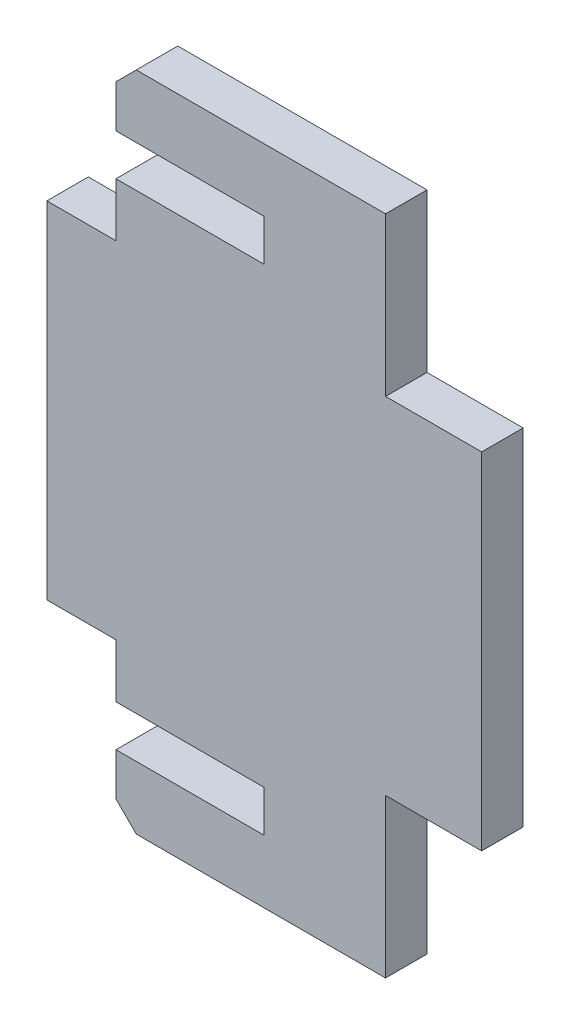
ISO-10303-21;
HEADER;
FILE_DESCRIPTION(('STEP AP214'),'2;1');
FILE_NAME('part.step','',(''),(''),'','','');
FILE_SCHEMA(('AUTOMOTIVE_DESIGN { 1 0 10303 214 1 1 1 1 }'));
ENDSEC;
DATA;
#1=APPLICATION_CONTEXT('core data for automotive mechanical design processes');
#2=APPLICATION_PROTOCOL_DEFINITION('international standard','automotive_design',2000,#1);
#3=PRODUCT_CONTEXT('',#1,'mechanical');
#4=PRODUCT('Part','Part','',(#3));
#5=PRODUCT_RELATED_PRODUCT_CATEGORY('part','',(#4));
#6=PRODUCT_DEFINITION_FORMATION('','',#4);
#7=PRODUCT_DEFINITION_CONTEXT('part definition',#1,'design');
#8=PRODUCT_DEFINITION('design','',#6,#7);
#9=PRODUCT_DEFINITION_SHAPE('','',#8);
#10=(LENGTH_UNIT() NAMED_UNIT(*) SI_UNIT(.MILLI.,.METRE.));
#11=(NAMED_UNIT(*) PLANE_ANGLE_UNIT() SI_UNIT($,.RADIAN.));
#12=(NAMED_UNIT(*) SI_UNIT($,.STERADIAN.) SOLID_ANGLE_UNIT());
#13=UNCERTAINTY_MEASURE_WITH_UNIT(LENGTH_MEASURE(1.E-05),#10,'distance_accuracy_value','');
#14=(GEOMETRIC_REPRESENTATION_CONTEXT(3) GLOBAL_UNCERTAINTY_ASSIGNED_CONTEXT((#13)) GLOBAL_UNIT_ASSIGNED_CONTEXT((#10,
#11,#12)) REPRESENTATION_CONTEXT('',''));
#15=CARTESIAN_POINT('',(0.,0.,0.));
#16=DIRECTION('',(0.,0.,1.));
#17=DIRECTION('',(1.,0.,0.));
#18=AXIS2_PLACEMENT_3D('',#15,#16,#17);
#19=CARTESIAN_POINT('',(610.776131740149,-34.8210432887047,-2.99999999999988));
#20=DIRECTION('',(0.,-1.,0.));
#21=DIRECTION('',(1.,0.,0.));
#22=AXIS2_PLACEMENT_3D('',#19,#20,#21);
#23=PLANE('',#22);
#24=DIRECTION('',(1.,0.,0.));
#25=VECTOR('',#24,1.);
#26=CARTESIAN_POINT('',(610.776131740149,-34.8210432887046,1.00613961606655E-13));
#27=LINE('',#26,#25);
#28=CARTESIAN_POINT('',(610.776131740149,-34.8210432887046,1.00613961606655E-13));
#29=VERTEX_POINT('',#28);
#30=CARTESIAN_POINT('',(628.807360223135,-34.8210432887047,0.));
#31=VERTEX_POINT('',#30);
#32=EDGE_CURVE('E180',#29,#31,#27,.T.);
#33=ORIENTED_EDGE('',*,*,#32,.F.);
#34=DIRECTION('',(0.,0.,1.));
#35=VECTOR('',#34,1.);
#36=CARTESIAN_POINT('',(610.776131740149,-34.8210432887047,-2.99999999999988));
#37=LINE('',#36,#35);
#38=CARTESIAN_POINT('',(610.776131740149,-34.8210432887047,-2.99999999999988));
#39=VERTEX_POINT('',#38);
#40=EDGE_CURVE('E11',#39,#29,#37,.T.);
#41=ORIENTED_EDGE('',*,*,#40,.F.);
#42=DIRECTION('',(1.,0.,0.));
#43=VECTOR('',#42,1.);
#44=CARTESIAN_POINT('',(610.776131740149,-34.8210432887047,-2.99999999999988));
#45=LINE('',#44,#43);
#46=CARTESIAN_POINT('',(628.807360223135,-34.8210432887046,-2.99999999999993));
#47=VERTEX_POINT('',#46);
#48=EDGE_CURVE('E182',#39,#47,#45,.T.);
#49=ORIENTED_EDGE('',*,*,#48,.T.);
#50=DIRECTION('',(0.,0.,1.));
#51=VECTOR('',#50,1.);
#52=CARTESIAN_POINT('',(628.807360223135,-34.8210432887046,-2.99999999999993));
#53=LINE('',#52,#51);
#54=EDGE_CURVE('E35',#47,#31,#53,.T.);
#55=ORIENTED_EDGE('',*,*,#54,.T.);
#56=EDGE_LOOP('',(#33,#41,#49,#55));
#57=FACE_BOUND('',#56,.T.);
#58=ADVANCED_FACE('F32',(#57),#23,.T.);
#59=CARTESIAN_POINT('',(610.776131740149,-34.8210432887047,-2.99999999999988));
#60=DIRECTION('',(-0.707106781186527,-0.707106781186567,0.));
#61=DIRECTION('',(0.707106781186568,-0.707106781186528,0.));
#62=AXIS2_PLACEMENT_3D('',#59,#60,#61);
#63=PLANE('',#62);
#64=DIRECTION('',(0.707106781186568,-0.707106781186528,0.));
#65=VECTOR('',#64,1.);
#66=CARTESIAN_POINT('',(610.776131740149,-34.8210432887046,1.00613961606655E-13));
#67=LINE('',#66,#65);
#68=CARTESIAN_POINT('',(609.307360223135,-33.3522717716907,0.));
#69=VERTEX_POINT('',#68);
#70=EDGE_CURVE('E198',#69,#29,#67,.T.);
#71=ORIENTED_EDGE('',*,*,#70,.F.);
#72=DIRECTION('',(0.,0.,1.));
#73=VECTOR('',#72,1.);
#74=CARTESIAN_POINT('',(609.307360223135,-33.3522717716906,-2.99999999999996));
#75=LINE('',#74,#73);
#76=CARTESIAN_POINT('',(609.307360223135,-33.3522717716906,-2.99999999999996));
#77=VERTEX_POINT('',#76);
#78=EDGE_CURVE('E40',#77,#69,#75,.T.);
#79=ORIENTED_EDGE('',*,*,#78,.F.);
#80=DIRECTION('',(0.707106781186568,-0.707106781186528,0.));
#81=VECTOR('',#80,1.);
#82=CARTESIAN_POINT('',(610.776131740149,-34.8210432887047,-2.99999999999988));
#83=LINE('',#82,#81);
#84=EDGE_CURVE('E187',#77,#39,#83,.T.);
#85=ORIENTED_EDGE('',*,*,#84,.T.);
#86=ORIENTED_EDGE('',*,*,#40,.T.);
#87=EDGE_LOOP('',(#71,#79,#85,#86));
#88=FACE_BOUND('',#87,.T.);
#89=ADVANCED_FACE('F430',(#88),#63,.T.);
#90=CARTESIAN_POINT('',(609.307360223135,-30.2698798894849,-2.99999999999993));
#91=DIRECTION('',(-1.,0.,0.));
#92=DIRECTION('',(0.,0.,1.));
#93=AXIS2_PLACEMENT_3D('',#90,#91,#92);
#94=PLANE('',#93);
#95=DIRECTION('',(0.,-1.,0.));
#96=VECTOR('',#95,1.);
#97=CARTESIAN_POINT('',(609.307360223135,-30.2698798894849,0.));
#98=LINE('',#97,#96);
#99=CARTESIAN_POINT('',(609.307360223135,-30.2698798894849,0.));
#100=VERTEX_POINT('',#99);
#101=EDGE_CURVE('E253',#100,#69,#98,.T.);
#102=ORIENTED_EDGE('',*,*,#101,.F.);
#103=DIRECTION('',(0.,0.,1.));
#104=VECTOR('',#103,1.);
#105=CARTESIAN_POINT('',(609.307360223135,-30.2698798894849,-2.99999999999993));
#106=LINE('',#105,#104);
#107=CARTESIAN_POINT('',(609.307360223135,-30.2698798894849,-2.99999999999993));
#108=VERTEX_POINT('',#107);
#109=EDGE_CURVE('E317',#108,#100,#106,.T.);
#110=ORIENTED_EDGE('',*,*,#109,.F.);
#111=DIRECTION('',(0.,-1.,0.));
#112=VECTOR('',#111,1.);
#113=CARTESIAN_POINT('',(609.307360223135,-30.2698798894849,-2.99999999999993));
#114=LINE('',#113,#112);
#115=EDGE_CURVE('E313',#108,#77,#114,.T.);
#116=ORIENTED_EDGE('',*,*,#115,.T.);
#117=ORIENTED_EDGE('',*,*,#78,.T.);
#118=EDGE_LOOP('',(#102,#110,#116,#117));
#119=FACE_BOUND('',#118,.T.);
#120=ADVANCED_FACE('F426',(#119),#94,.T.);
#121=CARTESIAN_POINT('',(620.002394878024,-30.2698798894849,-2.99999999999991));
#122=DIRECTION('',(0.,1.,0.));
#123=DIRECTION('',(-1.,0.,0.));
#124=AXIS2_PLACEMENT_3D('',#121,#122,#123);
#125=PLANE('',#124);
#126=DIRECTION('',(-1.,0.,0.));
#127=VECTOR('',#126,1.);
#128=CARTESIAN_POINT('',(620.002394878024,-30.2698798894848,0.));
#129=LINE('',#128,#127);
#130=CARTESIAN_POINT('',(620.002394878024,-30.2698798894848,0.));
#131=VERTEX_POINT('',#130);
#132=EDGE_CURVE('E250',#131,#100,#129,.T.);
#133=ORIENTED_EDGE('',*,*,#132,.F.);
#134=DIRECTION('',(0.,0.,1.));
#135=VECTOR('',#134,1.);
#136=CARTESIAN_POINT('',(620.002394878024,-30.2698798894849,-2.99999999999991));
#137=LINE('',#136,#135);
#138=CARTESIAN_POINT('',(620.002394878024,-30.2698798894849,-2.99999999999991));
#139=VERTEX_POINT('',#138);
#140=EDGE_CURVE('E319',#139,#131,#137,.T.);
#141=ORIENTED_EDGE('',*,*,#140,.F.);
#142=DIRECTION('',(-1.,0.,0.));
#143=VECTOR('',#142,1.);
#144=CARTESIAN_POINT('',(620.002394878024,-30.2698798894849,-2.99999999999991));
#145=LINE('',#144,#143);
#146=EDGE_CURVE('E310',#139,#108,#145,.T.);
#147=ORIENTED_EDGE('',*,*,#146,.T.);
#148=ORIENTED_EDGE('',*,*,#109,.T.);
#149=EDGE_LOOP('',(#133,#141,#147,#148));
#150=FACE_BOUND('',#149,.T.);
#151=ADVANCED_FACE('F422',(#150),#125,.T.);
#152=CARTESIAN_POINT('',(620.006556706234,-27.2698827762886,-2.99999999999989));
#153=DIRECTION('',(-0.99999903773209,0.0013872760700569,0.));
#154=DIRECTION('',(-0.00138727607005612,-0.99999903773209,0.));
#155=AXIS2_PLACEMENT_3D('',#152,#153,#154);
#156=PLANE('',#155);
#157=DIRECTION('',(-0.00138727607005612,-0.99999903773209,0.));
#158=VECTOR('',#157,1.);
#159=CARTESIAN_POINT('',(620.006556706234,-27.2698827762885,1.09287578986539E-13));
#160=LINE('',#159,#158);
#161=CARTESIAN_POINT('',(620.006556706234,-27.2698827762885,1.09287578986539E-13));
#162=VERTEX_POINT('',#161);
#163=EDGE_CURVE('E247',#162,#131,#160,.T.);
#164=ORIENTED_EDGE('',*,*,#163,.F.);
#165=DIRECTION('',(0.,0.,1.));
#166=VECTOR('',#165,1.);
#167=CARTESIAN_POINT('',(620.006556706234,-27.2698827762886,-2.99999999999989));
#168=LINE('',#167,#166);
#169=CARTESIAN_POINT('',(620.006556706234,-27.2698827762886,-2.99999999999989));
#170=VERTEX_POINT('',#169);
#171=EDGE_CURVE('E321',#170,#162,#168,.T.);
#172=ORIENTED_EDGE('',*,*,#171,.F.);
#173=DIRECTION('',(-0.00138727607005612,-0.99999903773209,0.));
#174=VECTOR('',#173,1.);
#175=CARTESIAN_POINT('',(620.006556706234,-27.2698827762886,-2.99999999999989));
#176=LINE('',#175,#174);
#177=EDGE_CURVE('E307',#170,#139,#176,.T.);
#178=ORIENTED_EDGE('',*,*,#177,.T.);
#179=ORIENTED_EDGE('',*,*,#140,.T.);
#180=EDGE_LOOP('',(#164,#172,#178,#179));
#181=FACE_BOUND('',#180,.T.);
#182=ADVANCED_FACE('F418',(#181),#156,.T.);
#183=CARTESIAN_POINT('',(609.307360223135,-27.2698827762886,-2.99999999999995));
#184=DIRECTION('',(0.,-1.,0.));
#185=DIRECTION('',(0.,0.,-1.));
#186=AXIS2_PLACEMENT_3D('',#183,#184,#185);
#187=PLANE('',#186);
#188=DIRECTION('',(1.,0.,0.));
#189=VECTOR('',#188,1.);
#190=CARTESIAN_POINT('',(609.307360223135,-27.2698827762886,0.));
#191=LINE('',#190,#189);
#192=CARTESIAN_POINT('',(609.307360223135,-27.2698827762886,0.));
#193=VERTEX_POINT('',#192);
#194=EDGE_CURVE('E244',#193,#162,#191,.T.);
#195=ORIENTED_EDGE('',*,*,#194,.F.);
#196=DIRECTION('',(0.,0.,1.));
#197=VECTOR('',#196,1.);
#198=CARTESIAN_POINT('',(609.307360223135,-27.2698827762886,-2.99999999999995));
#199=LINE('',#198,#197);
#200=CARTESIAN_POINT('',(609.307360223135,-27.2698827762886,-2.99999999999995));
#201=VERTEX_POINT('',#200);
#202=EDGE_CURVE('E323',#201,#193,#199,.T.);
#203=ORIENTED_EDGE('',*,*,#202,.F.);
#204=DIRECTION('',(1.,0.,0.));
#205=VECTOR('',#204,1.);
#206=CARTESIAN_POINT('',(609.307360223135,-27.2698827762886,-2.99999999999995));
#207=LINE('',#206,#205);
#208=EDGE_CURVE('E304',#201,#170,#207,.T.);
#209=ORIENTED_EDGE('',*,*,#208,.T.);
#210=ORIENTED_EDGE('',*,*,#171,.T.);
#211=EDGE_LOOP('',(#195,#203,#209,#210));
#212=FACE_BOUND('',#211,.T.);
#213=ADVANCED_FACE('F414',(#212),#187,.T.);
#214=CARTESIAN_POINT('',(609.307360223135,-23.3847686082293,-2.99999999999995));
#215=DIRECTION('',(-1.,0.,0.));
#216=DIRECTION('',(0.,-1.,0.));
#217=AXIS2_PLACEMENT_3D('',#214,#215,#216);
#218=PLANE('',#217);
#219=DIRECTION('',(0.,-1.,0.));
#220=VECTOR('',#219,1.);
#221=CARTESIAN_POINT('',(609.307360223135,-23.3847686082294,0.));
#222=LINE('',#221,#220);
#223=CARTESIAN_POINT('',(609.307360223135,-23.3847686082294,0.));
#224=VERTEX_POINT('',#223);
#225=EDGE_CURVE('E241',#224,#193,#222,.T.);
#226=ORIENTED_EDGE('',*,*,#225,.F.);
#227=DIRECTION('',(0.,0.,1.));
#228=VECTOR('',#227,1.);
#229=CARTESIAN_POINT('',(609.307360223135,-23.3847686082293,-2.99999999999995));
#230=LINE('',#229,#228);
#231=CARTESIAN_POINT('',(609.307360223135,-23.3847686082293,-2.99999999999995));
#232=VERTEX_POINT('',#231);
#233=EDGE_CURVE('E325',#232,#224,#230,.T.);
#234=ORIENTED_EDGE('',*,*,#233,.F.);
#235=DIRECTION('',(0.,-1.,0.));
#236=VECTOR('',#235,1.);
#237=CARTESIAN_POINT('',(609.307360223135,-23.3847686082293,-2.99999999999995));
#238=LINE('',#237,#236);
#239=EDGE_CURVE('E301',#232,#201,#238,.T.);
#240=ORIENTED_EDGE('',*,*,#239,.T.);
#241=ORIENTED_EDGE('',*,*,#202,.T.);
#242=EDGE_LOOP('',(#226,#234,#240,#241));
#243=FACE_BOUND('',#242,.T.);
#244=ADVANCED_FACE('F410',(#243),#218,.T.);
#245=CARTESIAN_POINT('',(604.307360223135,-23.3847686082293,-2.99999999999995));
#246=DIRECTION('',(0.,-1.,0.));
#247=DIRECTION('',(0.,0.,-1.));
#248=AXIS2_PLACEMENT_3D('',#245,#246,#247);
#249=PLANE('',#248);
#250=DIRECTION('',(1.,0.,0.));
#251=VECTOR('',#250,1.);
#252=CARTESIAN_POINT('',(604.307360223135,-23.3847686082294,1.02348685082632E-13));
#253=LINE('',#252,#251);
#254=CARTESIAN_POINT('',(604.307360223135,-23.3847686082294,1.02348685082632E-13));
#255=VERTEX_POINT('',#254);
#256=EDGE_CURVE('E238',#255,#224,#253,.T.);
#257=ORIENTED_EDGE('',*,*,#256,.F.);
#258=DIRECTION('',(0.,0.,1.));
#259=VECTOR('',#258,1.);
#260=CARTESIAN_POINT('',(604.307360223135,-23.3847686082293,-2.99999999999995));
#261=LINE('',#260,#259);
#262=CARTESIAN_POINT('',(604.307360223135,-23.3847686082293,-2.99999999999995));
#263=VERTEX_POINT('',#262);
#264=EDGE_CURVE('E327',#263,#255,#261,.T.);
#265=ORIENTED_EDGE('',*,*,#264,.F.);
#266=DIRECTION('',(1.,0.,0.));
#267=VECTOR('',#266,1.);
#268=CARTESIAN_POINT('',(604.307360223135,-23.3847686082293,-2.99999999999995));
#269=LINE('',#268,#267);
#270=EDGE_CURVE('E298',#263,#232,#269,.T.);
#271=ORIENTED_EDGE('',*,*,#270,.T.);
#272=ORIENTED_EDGE('',*,*,#233,.T.);
#273=EDGE_LOOP('',(#257,#265,#271,#272));
#274=FACE_BOUND('',#273,.T.);
#275=ADVANCED_FACE('F406',(#274),#249,.T.);
#276=CARTESIAN_POINT('',(604.307360223135,1.61523139177064,-2.99999999999992));
#277=DIRECTION('',(-1.,0.,0.));
#278=DIRECTION('',(0.,0.,1.));
#279=AXIS2_PLACEMENT_3D('',#276,#277,#278);
#280=PLANE('',#279);
#281=DIRECTION('',(0.,-1.,0.));
#282=VECTOR('',#281,1.);
#283=CARTESIAN_POINT('',(604.307360223135,1.61523139177069,0.));
#284=LINE('',#283,#282);
#285=CARTESIAN_POINT('',(604.307360223135,1.61523139177069,0.));
#286=VERTEX_POINT('',#285);
#287=EDGE_CURVE('E235',#286,#255,#284,.T.);
#288=ORIENTED_EDGE('',*,*,#287,.F.);
#289=DIRECTION('',(0.,0.,1.));
#290=VECTOR('',#289,1.);
#291=CARTESIAN_POINT('',(604.307360223135,1.61523139177064,-2.99999999999992));
#292=LINE('',#291,#290);
#293=CARTESIAN_POINT('',(604.307360223135,1.61523139177064,-2.99999999999992));
#294=VERTEX_POINT('',#293);
#295=EDGE_CURVE('E329',#294,#286,#292,.T.);
#296=ORIENTED_EDGE('',*,*,#295,.F.);
#297=DIRECTION('',(0.,-1.,0.));
#298=VECTOR('',#297,1.);
#299=CARTESIAN_POINT('',(604.307360223135,1.61523139177064,-2.99999999999992));
#300=LINE('',#299,#298);
#301=EDGE_CURVE('E295',#294,#263,#300,.T.);
#302=ORIENTED_EDGE('',*,*,#301,.T.);
#303=ORIENTED_EDGE('',*,*,#264,.T.);
#304=EDGE_LOOP('',(#288,#296,#302,#303));
#305=FACE_BOUND('',#304,.T.);
#306=ADVANCED_FACE('F402',(#305),#280,.T.);
#307=CARTESIAN_POINT('',(604.307360223135,1.61523139177064,-2.99999999999992));
#308=DIRECTION('',(0.,1.,0.));
#309=DIRECTION('',(-1.,0.,0.));
#310=AXIS2_PLACEMENT_3D('',#307,#308,#309);
#311=PLANE('',#310);
#312=DIRECTION('',(-1.,0.,0.));
#313=VECTOR('',#312,1.);
#314=CARTESIAN_POINT('',(604.307360223135,1.61523139177069,0.));
#315=LINE('',#314,#313);
#316=CARTESIAN_POINT('',(609.307360223135,1.61523139177061,0.));
#317=VERTEX_POINT('',#316);
#318=EDGE_CURVE('E232',#317,#286,#315,.T.);
#319=ORIENTED_EDGE('',*,*,#318,.F.);
#320=DIRECTION('',(0.,0.,1.));
#321=VECTOR('',#320,1.);
#322=CARTESIAN_POINT('',(609.307360223135,1.61523139177062,-2.99999999999994));
#323=LINE('',#322,#321);
#324=CARTESIAN_POINT('',(609.307360223135,1.61523139177062,-2.99999999999994));
#325=VERTEX_POINT('',#324);
#326=EDGE_CURVE('E331',#325,#317,#323,.T.);
#327=ORIENTED_EDGE('',*,*,#326,.F.);
#328=DIRECTION('',(-1.,0.,0.));
#329=VECTOR('',#328,1.);
#330=CARTESIAN_POINT('',(604.307360223135,1.61523139177064,-2.99999999999992));
#331=LINE('',#330,#329);
#332=EDGE_CURVE('E292',#325,#294,#331,.T.);
#333=ORIENTED_EDGE('',*,*,#332,.T.);
#334=ORIENTED_EDGE('',*,*,#295,.T.);
#335=EDGE_LOOP('',(#319,#327,#333,#334));
#336=FACE_BOUND('',#335,.T.);
#337=ADVANCED_FACE('F398',(#336),#311,.T.);
#338=CARTESIAN_POINT('',(609.307360223135,1.61523139177062,-2.99999999999994));
#339=DIRECTION('',(-1.,0.,0.));
#340=DIRECTION('',(0.,0.,1.));
#341=AXIS2_PLACEMENT_3D('',#338,#339,#340);
#342=PLANE('',#341);
#343=DIRECTION('',(0.,-1.,0.));
#344=VECTOR('',#343,1.);
#345=CARTESIAN_POINT('',(609.307360223135,1.61523139177061,0.));
#346=LINE('',#345,#344);
#347=CARTESIAN_POINT('',(609.307360223135,5.50034555982989,0.));
#348=VERTEX_POINT('',#347);
#349=EDGE_CURVE('E229',#348,#317,#346,.T.);
#350=ORIENTED_EDGE('',*,*,#349,.F.);
#351=DIRECTION('',(0.,0.,1.));
#352=VECTOR('',#351,1.);
#353=CARTESIAN_POINT('',(609.307360223135,5.50034555982994,-2.99999999999997));
#354=LINE('',#353,#352);
#355=CARTESIAN_POINT('',(609.307360223135,5.50034555982994,-2.99999999999997));
#356=VERTEX_POINT('',#355);
#357=EDGE_CURVE('E333',#356,#348,#354,.T.);
#358=ORIENTED_EDGE('',*,*,#357,.F.);
#359=DIRECTION('',(0.,-1.,0.));
#360=VECTOR('',#359,1.);
#361=CARTESIAN_POINT('',(609.307360223135,1.61523139177062,-2.99999999999994));
#362=LINE('',#361,#360);
#363=EDGE_CURVE('E289',#356,#325,#362,.T.);
#364=ORIENTED_EDGE('',*,*,#363,.T.);
#365=ORIENTED_EDGE('',*,*,#326,.T.);
#366=EDGE_LOOP('',(#350,#358,#364,#365));
#367=FACE_BOUND('',#366,.T.);
#368=ADVANCED_FACE('F394',(#367),#342,.T.);
#369=CARTESIAN_POINT('',(609.307360223135,5.50034555982994,-2.99999999999997));
#370=DIRECTION('',(0.,1.,0.));
#371=DIRECTION('',(0.,0.,1.));
#372=AXIS2_PLACEMENT_3D('',#369,#370,#371);
#373=PLANE('',#372);
#374=DIRECTION('',(-1.,0.,0.));
#375=VECTOR('',#374,1.);
#376=CARTESIAN_POINT('',(609.307360223135,5.50034555982989,0.));
#377=LINE('',#376,#375);
#378=CARTESIAN_POINT('',(620.006556706234,5.50034555982991,1.04083408558608E-13));
#379=VERTEX_POINT('',#378);
#380=EDGE_CURVE('E226',#379,#348,#377,.T.);
#381=ORIENTED_EDGE('',*,*,#380,.F.);
#382=DIRECTION('',(0.,0.,1.));
#383=VECTOR('',#382,1.);
#384=CARTESIAN_POINT('',(620.006556706234,5.50034555982985,-2.99999999999989));
#385=LINE('',#384,#383);
#386=CARTESIAN_POINT('',(620.006556706234,5.50034555982985,-2.99999999999989));
#387=VERTEX_POINT('',#386);
#388=EDGE_CURVE('E335',#387,#379,#385,.T.);
#389=ORIENTED_EDGE('',*,*,#388,.F.);
#390=DIRECTION('',(-1.,0.,0.));
#391=VECTOR('',#390,1.);
#392=CARTESIAN_POINT('',(609.307360223135,5.50034555982994,-2.99999999999997));
#393=LINE('',#392,#391);
#394=EDGE_CURVE('E286',#387,#356,#393,.T.);
#395=ORIENTED_EDGE('',*,*,#394,.T.);
#396=ORIENTED_EDGE('',*,*,#357,.T.);
#397=EDGE_LOOP('',(#381,#389,#395,#396));
#398=FACE_BOUND('',#397,.T.);
#399=ADVANCED_FACE('F390',(#398),#373,.T.);
#400=CARTESIAN_POINT('',(620.006556706234,5.50034555982985,-2.99999999999989));
#401=DIRECTION('',(-0.99999903773209,-0.00138727607005623,0.));
#402=DIRECTION('',(0.00138727607005706,-0.99999903773209,0.));
#403=AXIS2_PLACEMENT_3D('',#400,#401,#402);
#404=PLANE('',#403);
#405=DIRECTION('',(0.00138727607005706,-0.99999903773209,0.));
#406=VECTOR('',#405,1.);
#407=CARTESIAN_POINT('',(620.006556706234,5.50034555982991,1.04083408558608E-13));
#408=LINE('',#407,#406);
#409=CARTESIAN_POINT('',(620.002394878024,8.50034267302614,0.));
#410=VERTEX_POINT('',#409);
#411=EDGE_CURVE('E223',#410,#379,#408,.T.);
#412=ORIENTED_EDGE('',*,*,#411,.F.);
#413=DIRECTION('',(0.,0.,1.));
#414=VECTOR('',#413,1.);
#415=CARTESIAN_POINT('',(620.002394878024,8.5003426730262,-2.99999999999994));
#416=LINE('',#415,#414);
#417=CARTESIAN_POINT('',(620.002394878024,8.5003426730262,-2.99999999999994));
#418=VERTEX_POINT('',#417);
#419=EDGE_CURVE('E337',#418,#410,#416,.T.);
#420=ORIENTED_EDGE('',*,*,#419,.F.);
#421=DIRECTION('',(0.00138727607005706,-0.99999903773209,0.));
#422=VECTOR('',#421,1.);
#423=CARTESIAN_POINT('',(620.006556706234,5.50034555982985,-2.99999999999989));
#424=LINE('',#423,#422);
#425=EDGE_CURVE('E283',#418,#387,#424,.T.);
#426=ORIENTED_EDGE('',*,*,#425,.T.);
#427=ORIENTED_EDGE('',*,*,#388,.T.);
#428=EDGE_LOOP('',(#412,#420,#426,#427));
#429=FACE_BOUND('',#428,.T.);
#430=ADVANCED_FACE('F386',(#429),#404,.T.);
#431=CARTESIAN_POINT('',(620.002394878024,8.5003426730262,-2.99999999999994));
#432=DIRECTION('',(0.,-1.,0.));
#433=DIRECTION('',(0.,0.,-1.));
#434=AXIS2_PLACEMENT_3D('',#431,#432,#433);
#435=PLANE('',#434);
#436=DIRECTION('',(1.,0.,0.));
#437=VECTOR('',#436,1.);
#438=CARTESIAN_POINT('',(620.002394878024,8.50034267302614,0.));
#439=LINE('',#438,#437);
#440=CARTESIAN_POINT('',(609.307360223135,8.5003426730261,0.));
#441=VERTEX_POINT('',#440);
#442=EDGE_CURVE('E220',#441,#410,#439,.T.);
#443=ORIENTED_EDGE('',*,*,#442,.F.);
#444=DIRECTION('',(0.,0.,1.));
#445=VECTOR('',#444,1.);
#446=CARTESIAN_POINT('',(609.307360223135,8.50034267302618,-2.99999999999997));
#447=LINE('',#446,#445);
#448=CARTESIAN_POINT('',(609.307360223135,8.50034267302618,-2.99999999999997));
#449=VERTEX_POINT('',#448);
#450=EDGE_CURVE('E339',#449,#441,#447,.T.);
#451=ORIENTED_EDGE('',*,*,#450,.F.);
#452=DIRECTION('',(1.,0.,0.));
#453=VECTOR('',#452,1.);
#454=CARTESIAN_POINT('',(620.002394878024,8.5003426730262,-2.99999999999994));
#455=LINE('',#454,#453);
#456=EDGE_CURVE('E280',#449,#418,#455,.T.);
#457=ORIENTED_EDGE('',*,*,#456,.T.);
#458=ORIENTED_EDGE('',*,*,#419,.T.);
#459=EDGE_LOOP('',(#443,#451,#457,#458));
#460=FACE_BOUND('',#459,.T.);
#461=ADVANCED_FACE('F382',(#460),#435,.T.);
#462=CARTESIAN_POINT('',(609.307360223135,8.50034267302618,-2.99999999999997));
#463=DIRECTION('',(-1.,0.,0.));
#464=DIRECTION('',(0.,0.,1.));
#465=AXIS2_PLACEMENT_3D('',#462,#463,#464);
#466=PLANE('',#465);
#467=DIRECTION('',(0.,-1.,0.));
#468=VECTOR('',#467,1.);
#469=CARTESIAN_POINT('',(609.307360223135,8.5003426730261,0.));
#470=LINE('',#469,#468);
#471=CARTESIAN_POINT('',(609.307360223135,11.5827345552319,0.));
#472=VERTEX_POINT('',#471);
#473=EDGE_CURVE('E217',#472,#441,#470,.T.);
#474=ORIENTED_EDGE('',*,*,#473,.F.);
#475=DIRECTION('',(0.,0.,1.));
#476=VECTOR('',#475,1.);
#477=CARTESIAN_POINT('',(609.307360223135,11.5827345552319,-2.99999999999993));
#478=LINE('',#477,#476);
#479=CARTESIAN_POINT('',(609.307360223135,11.5827345552319,-2.99999999999993));
#480=VERTEX_POINT('',#479);
#481=EDGE_CURVE('E341',#480,#472,#478,.T.);
#482=ORIENTED_EDGE('',*,*,#481,.F.);
#483=DIRECTION('',(0.,-1.,0.));
#484=VECTOR('',#483,1.);
#485=CARTESIAN_POINT('',(609.307360223135,8.50034267302618,-2.99999999999997));
#486=LINE('',#485,#484);
#487=EDGE_CURVE('E277',#480,#449,#486,.T.);
#488=ORIENTED_EDGE('',*,*,#487,.T.);
#489=ORIENTED_EDGE('',*,*,#450,.T.);
#490=EDGE_LOOP('',(#474,#482,#488,#489));
#491=FACE_BOUND('',#490,.T.);
#492=ADVANCED_FACE('F378',(#491),#466,.T.);
#493=CARTESIAN_POINT('',(610.776131740149,13.0515060722459,-2.99999999999991));
#494=DIRECTION('',(-0.707106781186533,0.707106781186563,0.));
#495=DIRECTION('',(-0.707106781186563,-0.707106781186532,0.));
#496=AXIS2_PLACEMENT_3D('',#493,#494,#495);
#497=PLANE('',#496);
#498=DIRECTION('',(-0.707106781186563,-0.707106781186532,0.));
#499=VECTOR('',#498,1.);
#500=CARTESIAN_POINT('',(610.776131740149,13.0515060722459,1.04083408558608E-13));
#501=LINE('',#500,#499);
#502=CARTESIAN_POINT('',(610.776131740149,13.0515060722459,1.04083408558608E-13));
#503=VERTEX_POINT('',#502);
#504=EDGE_CURVE('E214',#503,#472,#501,.T.);
#505=ORIENTED_EDGE('',*,*,#504,.F.);
#506=DIRECTION('',(0.,0.,1.));
#507=VECTOR('',#506,1.);
#508=CARTESIAN_POINT('',(610.776131740149,13.0515060722459,-2.99999999999991));
#509=LINE('',#508,#507);
#510=CARTESIAN_POINT('',(610.776131740149,13.0515060722459,-2.99999999999991));
#511=VERTEX_POINT('',#510);
#512=EDGE_CURVE('E343',#511,#503,#509,.T.);
#513=ORIENTED_EDGE('',*,*,#512,.F.);
#514=DIRECTION('',(-0.707106781186563,-0.707106781186532,0.));
#515=VECTOR('',#514,1.);
#516=CARTESIAN_POINT('',(610.776131740149,13.0515060722459,-2.99999999999991));
#517=LINE('',#516,#515);
#518=EDGE_CURVE('E274',#511,#480,#517,.T.);
#519=ORIENTED_EDGE('',*,*,#518,.T.);
#520=ORIENTED_EDGE('',*,*,#481,.T.);
#521=EDGE_LOOP('',(#505,#513,#519,#520));
#522=FACE_BOUND('',#521,.T.);
#523=ADVANCED_FACE('F374',(#522),#497,.T.);
#524=CARTESIAN_POINT('',(610.776131740149,13.0515060722459,-2.99999999999991));
#525=DIRECTION('',(0.,1.,0.));
#526=DIRECTION('',(0.,0.,1.));
#527=AXIS2_PLACEMENT_3D('',#524,#525,#526);
#528=PLANE('',#527);
#529=DIRECTION('',(-1.,0.,0.));
#530=VECTOR('',#529,1.);
#531=CARTESIAN_POINT('',(610.776131740149,13.0515060722459,1.04083408558608E-13));
#532=LINE('',#531,#530);
#533=CARTESIAN_POINT('',(628.807360223135,13.0515060722459,1.04083408558608E-13));
#534=VERTEX_POINT('',#533);
#535=EDGE_CURVE('E211',#534,#503,#532,.T.);
#536=ORIENTED_EDGE('',*,*,#535,.F.);
#537=DIRECTION('',(0.,0.,1.));
#538=VECTOR('',#537,1.);
#539=CARTESIAN_POINT('',(628.807360223135,13.0515060722459,-2.99999999999989));
#540=LINE('',#539,#538);
#541=CARTESIAN_POINT('',(628.807360223135,13.0515060722459,-2.99999999999989));
#542=VERTEX_POINT('',#541);
#543=EDGE_CURVE('E345',#542,#534,#540,.T.);
#544=ORIENTED_EDGE('',*,*,#543,.F.);
#545=DIRECTION('',(-1.,0.,0.));
#546=VECTOR('',#545,1.);
#547=CARTESIAN_POINT('',(610.776131740149,13.0515060722459,-2.99999999999991));
#548=LINE('',#547,#546);
#549=EDGE_CURVE('E271',#542,#511,#548,.T.);
#550=ORIENTED_EDGE('',*,*,#549,.T.);
#551=ORIENTED_EDGE('',*,*,#512,.T.);
#552=EDGE_LOOP('',(#536,#544,#550,#551));
#553=FACE_BOUND('',#552,.T.);
#554=ADVANCED_FACE('F370',(#553),#528,.T.);
#555=CARTESIAN_POINT('',(628.807360223135,13.0515060722459,-2.99999999999989));
#556=DIRECTION('',(1.,0.,0.));
#557=DIRECTION('',(0.,0.,-1.));
#558=AXIS2_PLACEMENT_3D('',#555,#556,#557);
#559=PLANE('',#558);
#560=DIRECTION('',(0.,1.,0.));
#561=VECTOR('',#560,1.);
#562=CARTESIAN_POINT('',(628.807360223135,13.0515060722459,1.04083408558608E-13));
#563=LINE('',#562,#561);
#564=CARTESIAN_POINT('',(628.807360223135,1.61523139177062,0.));
#565=VERTEX_POINT('',#564);
#566=EDGE_CURVE('E208',#565,#534,#563,.T.);
#567=ORIENTED_EDGE('',*,*,#566,.F.);
#568=DIRECTION('',(0.,0.,1.));
#569=VECTOR('',#568,1.);
#570=CARTESIAN_POINT('',(628.807360223135,1.61523139177062,-2.99999999999992));
#571=LINE('',#570,#569);
#572=CARTESIAN_POINT('',(628.807360223135,1.61523139177062,-2.99999999999992));
#573=VERTEX_POINT('',#572);
#574=EDGE_CURVE('E347',#573,#565,#571,.T.);
#575=ORIENTED_EDGE('',*,*,#574,.F.);
#576=DIRECTION('',(0.,1.,0.));
#577=VECTOR('',#576,1.);
#578=CARTESIAN_POINT('',(628.807360223135,13.0515060722459,-2.99999999999989));
#579=LINE('',#578,#577);
#580=EDGE_CURVE('E268',#573,#542,#579,.T.);
#581=ORIENTED_EDGE('',*,*,#580,.T.);
#582=ORIENTED_EDGE('',*,*,#543,.T.);
#583=EDGE_LOOP('',(#567,#575,#581,#582));
#584=FACE_BOUND('',#583,.T.);
#585=ADVANCED_FACE('F366',(#584),#559,.T.);
#586=CARTESIAN_POINT('',(635.760704602235,1.61523139177065,-2.99999999999992));
#587=DIRECTION('',(0.,1.,0.));
#588=DIRECTION('',(0.,0.,1.));
#589=AXIS2_PLACEMENT_3D('',#586,#587,#588);
#590=PLANE('',#589);
#591=DIRECTION('',(-1.,0.,0.));
#592=VECTOR('',#591,1.);
#593=CARTESIAN_POINT('',(635.760704602235,1.6152313917707,0.));
#594=LINE('',#593,#592);
#595=CARTESIAN_POINT('',(635.760704602235,1.6152313917707,0.));
#596=VERTEX_POINT('',#595);
#597=EDGE_CURVE('E205',#596,#565,#594,.T.);
#598=ORIENTED_EDGE('',*,*,#597,.F.);
#599=DIRECTION('',(0.,0.,1.));
#600=VECTOR('',#599,1.);
#601=CARTESIAN_POINT('',(635.760704602235,1.61523139177065,-2.99999999999992));
#602=LINE('',#601,#600);
#603=CARTESIAN_POINT('',(635.760704602235,1.61523139177065,-2.99999999999992));
#604=VERTEX_POINT('',#603);
#605=EDGE_CURVE('E349',#604,#596,#602,.T.);
#606=ORIENTED_EDGE('',*,*,#605,.F.);
#607=DIRECTION('',(-1.,0.,0.));
#608=VECTOR('',#607,1.);
#609=CARTESIAN_POINT('',(635.760704602235,1.61523139177065,-2.99999999999992));
#610=LINE('',#609,#608);
#611=EDGE_CURVE('E265',#604,#573,#610,.T.);
#612=ORIENTED_EDGE('',*,*,#611,.T.);
#613=ORIENTED_EDGE('',*,*,#574,.T.);
#614=EDGE_LOOP('',(#598,#606,#612,#613));
#615=FACE_BOUND('',#614,.T.);
#616=ADVANCED_FACE('F362',(#615),#590,.T.);
#617=CARTESIAN_POINT('',(635.760704602235,-23.3847686082293,-2.99999999999995));
#618=DIRECTION('',(1.,0.,0.));
#619=DIRECTION('',(0.,0.,-1.));
#620=AXIS2_PLACEMENT_3D('',#617,#618,#619);
#621=PLANE('',#620);
#622=DIRECTION('',(0.,1.,0.));
#623=VECTOR('',#622,1.);
#624=CARTESIAN_POINT('',(635.760704602235,-23.3847686082294,0.));
#625=LINE('',#624,#623);
#626=CARTESIAN_POINT('',(635.760704602235,-23.3847686082294,0.));
#627=VERTEX_POINT('',#626);
#628=EDGE_CURVE('E202',#627,#596,#625,.T.);
#629=ORIENTED_EDGE('',*,*,#628,.F.);
#630=DIRECTION('',(0.,0.,1.));
#631=VECTOR('',#630,1.);
#632=CARTESIAN_POINT('',(635.760704602235,-23.3847686082293,-2.99999999999995));
#633=LINE('',#632,#631);
#634=CARTESIAN_POINT('',(635.760704602235,-23.3847686082293,-2.99999999999995));
#635=VERTEX_POINT('',#634);
#636=EDGE_CURVE('E351',#635,#627,#633,.T.);
#637=ORIENTED_EDGE('',*,*,#636,.F.);
#638=DIRECTION('',(0.,1.,0.));
#639=VECTOR('',#638,1.);
#640=CARTESIAN_POINT('',(635.760704602235,-23.3847686082293,-2.99999999999995));
#641=LINE('',#640,#639);
#642=EDGE_CURVE('E262',#635,#604,#641,.T.);
#643=ORIENTED_EDGE('',*,*,#642,.T.);
#644=ORIENTED_EDGE('',*,*,#605,.T.);
#645=EDGE_LOOP('',(#629,#637,#643,#644));
#646=FACE_BOUND('',#645,.T.);
#647=ADVANCED_FACE('F358',(#646),#621,.T.);
#648=CARTESIAN_POINT('',(635.760704602235,-23.3847686082293,-2.99999999999995));
#649=DIRECTION('',(0.,-1.,0.));
#650=DIRECTION('',(0.,0.,-1.));
#651=AXIS2_PLACEMENT_3D('',#648,#649,#650);
#652=PLANE('',#651);
#653=DIRECTION('',(1.,0.,0.));
#654=VECTOR('',#653,1.);
#655=CARTESIAN_POINT('',(635.760704602235,-23.3847686082294,0.));
#656=LINE('',#655,#654);
#657=CARTESIAN_POINT('',(628.807360223135,-23.3847686082294,0.));
#658=VERTEX_POINT('',#657);
#659=EDGE_CURVE('E194',#658,#627,#656,.T.);
#660=ORIENTED_EDGE('',*,*,#659,.F.);
#661=DIRECTION('',(0.,0.,1.));
#662=VECTOR('',#661,1.);
#663=CARTESIAN_POINT('',(628.807360223135,-23.3847686082293,-2.99999999999993));
#664=LINE('',#663,#662);
#665=CARTESIAN_POINT('',(628.807360223135,-23.3847686082293,-2.99999999999993));
#666=VERTEX_POINT('',#665);
#667=EDGE_CURVE('E186',#666,#658,#664,.T.);
#668=ORIENTED_EDGE('',*,*,#667,.F.);
#669=DIRECTION('',(1.,0.,0.));
#670=VECTOR('',#669,1.);
#671=CARTESIAN_POINT('',(635.760704602235,-23.3847686082293,-2.99999999999995));
#672=LINE('',#671,#670);
#673=EDGE_CURVE('E259',#666,#635,#672,.T.);
#674=ORIENTED_EDGE('',*,*,#673,.T.);
#675=ORIENTED_EDGE('',*,*,#636,.T.);
#676=EDGE_LOOP('',(#660,#668,#674,#675));
#677=FACE_BOUND('',#676,.T.);
#678=ADVANCED_FACE('F354',(#677),#652,.T.);
#679=CARTESIAN_POINT('',(628.807360223135,-34.8210432887046,-2.99999999999993));
#680=DIRECTION('',(1.,0.,0.));
#681=DIRECTION('',(0.,0.,-1.));
#682=AXIS2_PLACEMENT_3D('',#679,#680,#681);
#683=PLANE('',#682);
#684=DIRECTION('',(0.,1.,0.));
#685=VECTOR('',#684,1.);
#686=CARTESIAN_POINT('',(628.807360223135,-34.8210432887047,0.));
#687=LINE('',#686,#685);
#688=EDGE_CURVE('E189',#31,#658,#687,.T.);
#689=ORIENTED_EDGE('',*,*,#688,.F.);
#690=ORIENTED_EDGE('',*,*,#54,.F.);
#691=DIRECTION('',(0.,1.,0.));
#692=VECTOR('',#691,1.);
#693=CARTESIAN_POINT('',(628.807360223135,-34.8210432887046,-2.99999999999993));
#694=LINE('',#693,#692);
#695=EDGE_CURVE('E257',#47,#666,#694,.T.);
#696=ORIENTED_EDGE('',*,*,#695,.T.);
#697=ORIENTED_EDGE('',*,*,#667,.T.);
#698=EDGE_LOOP('',(#689,#690,#696,#697));
#699=FACE_BOUND('',#698,.T.);
#700=ADVANCED_FACE('F190',(#699),#683,.T.);
#701=CARTESIAN_POINT('',(628.807360223135,-34.8210432887046,-2.99999999999993));
#702=DIRECTION('',(0.,0.,1.));
#703=DIRECTION('',(1.,0.,0.));
#704=AXIS2_PLACEMENT_3D('',#701,#702,#703);
#705=PLANE('',#704);
#706=ORIENTED_EDGE('',*,*,#48,.F.);
#707=ORIENTED_EDGE('',*,*,#84,.F.);
#708=ORIENTED_EDGE('',*,*,#115,.F.);
#709=ORIENTED_EDGE('',*,*,#146,.F.);
#710=ORIENTED_EDGE('',*,*,#177,.F.);
#711=ORIENTED_EDGE('',*,*,#208,.F.);
#712=ORIENTED_EDGE('',*,*,#239,.F.);
#713=ORIENTED_EDGE('',*,*,#270,.F.);
#714=ORIENTED_EDGE('',*,*,#301,.F.);
#715=ORIENTED_EDGE('',*,*,#332,.F.);
#716=ORIENTED_EDGE('',*,*,#363,.F.);
#717=ORIENTED_EDGE('',*,*,#394,.F.);
#718=ORIENTED_EDGE('',*,*,#425,.F.);
#719=ORIENTED_EDGE('',*,*,#456,.F.);
#720=ORIENTED_EDGE('',*,*,#487,.F.);
#721=ORIENTED_EDGE('',*,*,#518,.F.);
#722=ORIENTED_EDGE('',*,*,#549,.F.);
#723=ORIENTED_EDGE('',*,*,#580,.F.);
#724=ORIENTED_EDGE('',*,*,#611,.F.);
#725=ORIENTED_EDGE('',*,*,#642,.F.);
#726=ORIENTED_EDGE('',*,*,#673,.F.);
#727=ORIENTED_EDGE('',*,*,#695,.F.);
#728=EDGE_LOOP('',(#706,#707,#708,#709,#710,#711,#712,#713,#714,#715,#716,#717,#718,#719,#720,
#721,#722,#723,#724,#725,#726,#727));
#729=FACE_BOUND('',#728,.T.);
#730=ADVANCED_FACE('F429',(#729),#705,.F.);
#731=CARTESIAN_POINT('',(628.807360223135,-34.8210432887047,0.));
#732=DIRECTION('',(0.,0.,1.));
#733=DIRECTION('',(1.,0.,0.));
#734=AXIS2_PLACEMENT_3D('',#731,#732,#733);
#735=PLANE('',#734);
#736=ORIENTED_EDGE('',*,*,#32,.T.);
#737=ORIENTED_EDGE('',*,*,#688,.T.);
#738=ORIENTED_EDGE('',*,*,#659,.T.);
#739=ORIENTED_EDGE('',*,*,#628,.T.);
#740=ORIENTED_EDGE('',*,*,#597,.T.);
#741=ORIENTED_EDGE('',*,*,#566,.T.);
#742=ORIENTED_EDGE('',*,*,#535,.T.);
#743=ORIENTED_EDGE('',*,*,#504,.T.);
#744=ORIENTED_EDGE('',*,*,#473,.T.);
#745=ORIENTED_EDGE('',*,*,#442,.T.);
#746=ORIENTED_EDGE('',*,*,#411,.T.);
#747=ORIENTED_EDGE('',*,*,#380,.T.);
#748=ORIENTED_EDGE('',*,*,#349,.T.);
#749=ORIENTED_EDGE('',*,*,#318,.T.);
#750=ORIENTED_EDGE('',*,*,#287,.T.);
#751=ORIENTED_EDGE('',*,*,#256,.T.);
#752=ORIENTED_EDGE('',*,*,#225,.T.);
#753=ORIENTED_EDGE('',*,*,#194,.T.);
#754=ORIENTED_EDGE('',*,*,#163,.T.);
#755=ORIENTED_EDGE('',*,*,#132,.T.);
#756=ORIENTED_EDGE('',*,*,#101,.T.);
#757=ORIENTED_EDGE('',*,*,#70,.T.);
#758=EDGE_LOOP('',(#736,#737,#738,#739,#740,#741,#742,#743,#744,#745,#746,#747,#748,#749,#750,
#751,#752,#753,#754,#755,#756,#757));
#759=FACE_BOUND('',#758,.T.);
#760=ADVANCED_FACE('F196',(#759),#735,.T.);
#761=CLOSED_SHELL('',(#58,#89,#120,#151,#182,#213,#244,#275,#306,#337,#368,#399,#430,#461,#492,
#523,#554,#585,#616,#647,#678,#700,#730,#760));
#762=MANIFOLD_SOLID_BREP('B2',#761);
#763=ADVANCED_BREP_SHAPE_REPRESENTATION('',(#18,#762),#14);
#764=SHAPE_DEFINITION_REPRESENTATION(#9,#763);
ENDSEC;
END-ISO-10303-21;
